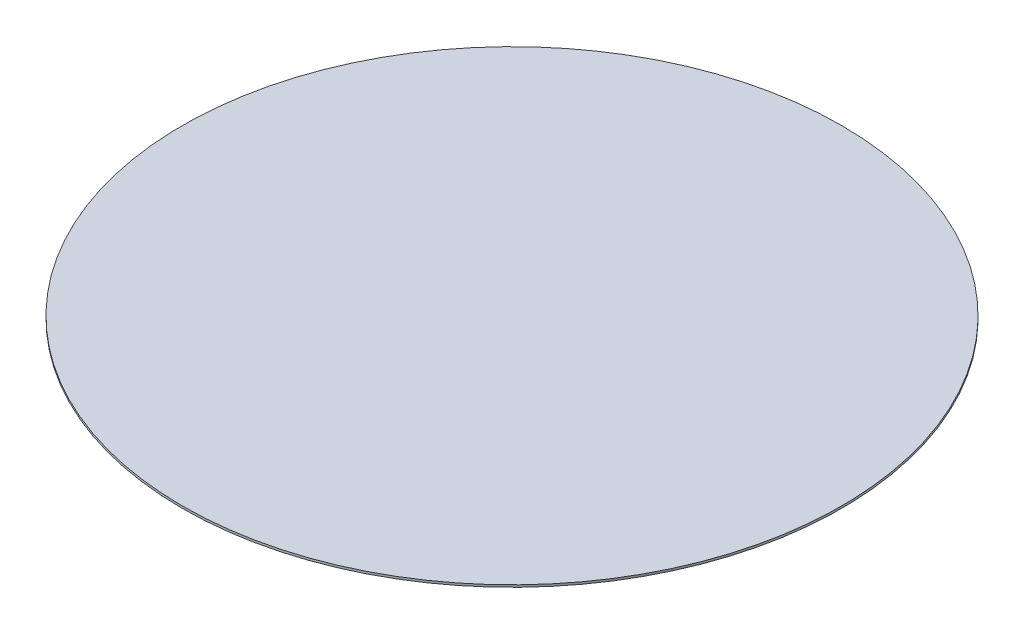
ISO-10303-21;
HEADER;
FILE_DESCRIPTION(('STEP AP214'),'2;1');
FILE_NAME('part.step','',(''),(''),'','','');
FILE_SCHEMA(('AUTOMOTIVE_DESIGN { 1 0 10303 214 1 1 1 1 }'));
ENDSEC;
DATA;
#1=APPLICATION_CONTEXT('core data for automotive mechanical design processes');
#2=APPLICATION_PROTOCOL_DEFINITION('international standard','automotive_design',2000,#1);
#3=PRODUCT_CONTEXT('',#1,'mechanical');
#4=PRODUCT('Part','Part','',(#3));
#5=PRODUCT_RELATED_PRODUCT_CATEGORY('part','',(#4));
#6=PRODUCT_DEFINITION_FORMATION('','',#4);
#7=PRODUCT_DEFINITION_CONTEXT('part definition',#1,'design');
#8=PRODUCT_DEFINITION('design','',#6,#7);
#9=PRODUCT_DEFINITION_SHAPE('','',#8);
#10=(LENGTH_UNIT() NAMED_UNIT(*) SI_UNIT(.MILLI.,.METRE.));
#11=(NAMED_UNIT(*) PLANE_ANGLE_UNIT() SI_UNIT($,.RADIAN.));
#12=(NAMED_UNIT(*) SI_UNIT($,.STERADIAN.) SOLID_ANGLE_UNIT());
#13=UNCERTAINTY_MEASURE_WITH_UNIT(LENGTH_MEASURE(1.E-05),#10,'distance_accuracy_value','');
#14=(GEOMETRIC_REPRESENTATION_CONTEXT(3) GLOBAL_UNCERTAINTY_ASSIGNED_CONTEXT((#13)) GLOBAL_UNIT_ASSIGNED_CONTEXT((#10,
#11,#12)) REPRESENTATION_CONTEXT('',''));
#15=CARTESIAN_POINT('',(0.,0.,0.));
#16=DIRECTION('',(0.,0.,1.));
#17=DIRECTION('',(1.,0.,0.));
#18=AXIS2_PLACEMENT_3D('',#15,#16,#17);
#19=CARTESIAN_POINT('',(0.,0.254,0.));
#20=DIRECTION('',(0.,-1.,0.));
#21=DIRECTION('',(0.,0.,-1.));
#22=AXIS2_PLACEMENT_3D('',#19,#20,#21);
#23=CYLINDRICAL_SURFACE('',#22,38.1);
#24=CARTESIAN_POINT('',(0.,0.254,0.));
#25=DIRECTION('',(0.,1.,0.));
#26=DIRECTION('',(0.,0.,1.));
#27=AXIS2_PLACEMENT_3D('',#24,#25,#26);
#28=CIRCLE('',#27,38.1);
#29=CARTESIAN_POINT('',(0.,0.254,38.1));
#30=VERTEX_POINT('',#29);
#31=EDGE_CURVE('E10',#30,#30,#28,.T.);
#32=ORIENTED_EDGE('',*,*,#31,.F.);
#33=EDGE_LOOP('',(#32));
#34=FACE_BOUND('',#33,.T.);
#35=CARTESIAN_POINT('',(0.,0.,0.));
#36=DIRECTION('',(0.,1.,0.));
#37=DIRECTION('',(0.,0.,1.));
#38=AXIS2_PLACEMENT_3D('',#35,#36,#37);
#39=CIRCLE('',#38,38.1);
#40=CARTESIAN_POINT('',(0.,0.,38.1));
#41=VERTEX_POINT('',#40);
#42=EDGE_CURVE('E37',#41,#41,#39,.T.);
#43=ORIENTED_EDGE('',*,*,#42,.T.);
#44=EDGE_LOOP('',(#43));
#45=FACE_BOUND('',#44,.T.);
#46=ADVANCED_FACE('F34',(#34,#45),#23,.T.);
#47=CARTESIAN_POINT('',(0.,0.254,0.));
#48=DIRECTION('',(0.,1.,0.));
#49=DIRECTION('',(0.,0.,1.));
#50=AXIS2_PLACEMENT_3D('',#47,#48,#49);
#51=PLANE('',#50);
#52=ORIENTED_EDGE('',*,*,#31,.T.);
#53=EDGE_LOOP('',(#52));
#54=FACE_BOUND('',#53,.T.);
#55=ADVANCED_FACE('F49',(#54),#51,.T.);
#56=CARTESIAN_POINT('',(0.,0.,0.));
#57=DIRECTION('',(0.,1.,0.));
#58=DIRECTION('',(0.,0.,1.));
#59=AXIS2_PLACEMENT_3D('',#56,#57,#58);
#60=PLANE('',#59);
#61=ORIENTED_EDGE('',*,*,#42,.F.);
#62=EDGE_LOOP('',(#61));
#63=FACE_BOUND('',#62,.T.);
#64=ADVANCED_FACE('F47',(#63),#60,.F.);
#65=CLOSED_SHELL('',(#46,#55,#64));
#66=MANIFOLD_SOLID_BREP('B2',#65);
#67=ADVANCED_BREP_SHAPE_REPRESENTATION('',(#18,#66),#14);
#68=SHAPE_DEFINITION_REPRESENTATION(#9,#67);
ENDSEC;
END-ISO-10303-21;
